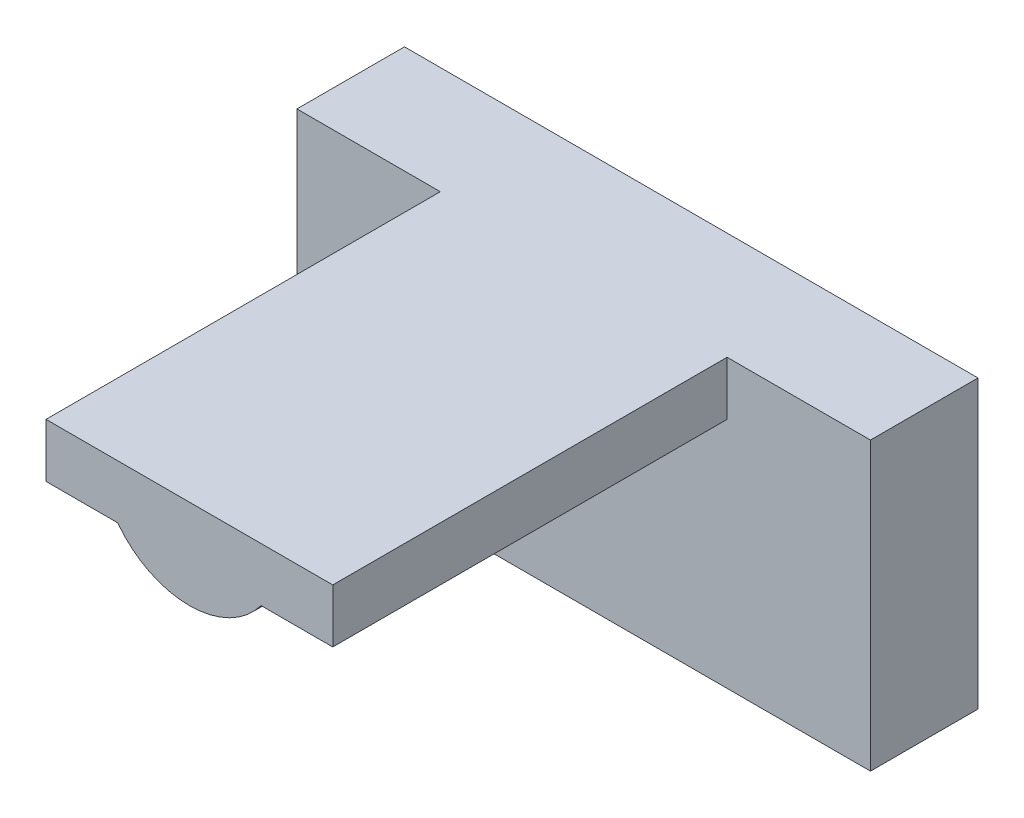
ISO-10303-21;
HEADER;
FILE_DESCRIPTION(('STEP AP214'),'2;1');
FILE_NAME('part.step','',(''),(''),'','','');
FILE_SCHEMA(('AUTOMOTIVE_DESIGN { 1 0 10303 214 1 1 1 1 }'));
ENDSEC;
DATA;
#1=APPLICATION_CONTEXT('core data for automotive mechanical design processes');
#2=APPLICATION_PROTOCOL_DEFINITION('international standard','automotive_design',2000,#1);
#3=PRODUCT_CONTEXT('',#1,'mechanical');
#4=PRODUCT('Part','Part','',(#3));
#5=PRODUCT_RELATED_PRODUCT_CATEGORY('part','',(#4));
#6=PRODUCT_DEFINITION_FORMATION('','',#4);
#7=PRODUCT_DEFINITION_CONTEXT('part definition',#1,'design');
#8=PRODUCT_DEFINITION('design','',#6,#7);
#9=PRODUCT_DEFINITION_SHAPE('','',#8);
#10=(LENGTH_UNIT() NAMED_UNIT(*) SI_UNIT(.MILLI.,.METRE.));
#11=(NAMED_UNIT(*) PLANE_ANGLE_UNIT() SI_UNIT($,.RADIAN.));
#12=(NAMED_UNIT(*) SI_UNIT($,.STERADIAN.) SOLID_ANGLE_UNIT());
#13=UNCERTAINTY_MEASURE_WITH_UNIT(LENGTH_MEASURE(1.E-05),#10,'distance_accuracy_value','');
#14=(GEOMETRIC_REPRESENTATION_CONTEXT(3) GLOBAL_UNCERTAINTY_ASSIGNED_CONTEXT((#13)) GLOBAL_UNIT_ASSIGNED_CONTEXT((#10,
#11,#12)) REPRESENTATION_CONTEXT('',''));
#15=CARTESIAN_POINT('',(0.,0.,0.));
#16=DIRECTION('',(0.,0.,1.));
#17=DIRECTION('',(1.,0.,0.));
#18=AXIS2_PLACEMENT_3D('',#15,#16,#17);
#19=CARTESIAN_POINT('',(0.,0.,3.));
#20=DIRECTION('',(0.,0.,-1.));
#21=DIRECTION('',(-1.,0.,0.));
#22=AXIS2_PLACEMENT_3D('',#19,#20,#21);
#23=PLANE('',#22);
#24=DIRECTION('',(0.,-1.,0.));
#25=VECTOR('',#24,1.);
#26=CARTESIAN_POINT('',(-17.5695150583409,0.,3.));
#27=LINE('',#26,#25);
#28=CARTESIAN_POINT('',(-17.5695150583409,22.0447702701312,3.));
#29=VERTEX_POINT('',#28);
#30=CARTESIAN_POINT('',(-17.5695150583409,20.5447702701312,3.));
#31=VERTEX_POINT('',#30);
#32=EDGE_CURVE('E177',#29,#31,#27,.T.);
#33=ORIENTED_EDGE('',*,*,#32,.F.);
#34=DIRECTION('',(-1.,0.,0.));
#35=VECTOR('',#34,1.);
#36=CARTESIAN_POINT('',(-21.5695150583409,22.0447702701312,3.));
#37=LINE('',#36,#35);
#38=CARTESIAN_POINT('',(-21.5695150583409,22.0447702701312,3.));
#39=VERTEX_POINT('',#38);
#40=EDGE_CURVE('E229',#29,#39,#37,.T.);
#41=ORIENTED_EDGE('',*,*,#40,.T.);
#42=DIRECTION('',(0.,-1.,0.));
#43=VECTOR('',#42,1.);
#44=CARTESIAN_POINT('',(-21.5695150583409,14.0447702701312,3.));
#45=LINE('',#44,#43);
#46=CARTESIAN_POINT('',(-21.5695150583409,14.0447702701312,3.));
#47=VERTEX_POINT('',#46);
#48=EDGE_CURVE('E234',#39,#47,#45,.T.);
#49=ORIENTED_EDGE('',*,*,#48,.T.);
#50=DIRECTION('',(1.,0.,0.));
#51=VECTOR('',#50,1.);
#52=CARTESIAN_POINT('',(-21.5695150583409,14.0447702701312,3.));
#53=LINE('',#52,#51);
#54=CARTESIAN_POINT('',(-5.5695150583409,14.0447702701312,3.));
#55=VERTEX_POINT('',#54);
#56=EDGE_CURVE('E236',#47,#55,#53,.T.);
#57=ORIENTED_EDGE('',*,*,#56,.T.);
#58=DIRECTION('',(0.,1.,0.));
#59=VECTOR('',#58,1.);
#60=CARTESIAN_POINT('',(-5.5695150583409,14.0447702701312,3.));
#61=LINE('',#60,#59);
#62=CARTESIAN_POINT('',(-5.5695150583409,22.0447702701312,3.));
#63=VERTEX_POINT('',#62);
#64=EDGE_CURVE('E226',#55,#63,#61,.T.);
#65=ORIENTED_EDGE('',*,*,#64,.T.);
#66=CARTESIAN_POINT('',(-9.5695150583409,22.0447702701312,3.));
#67=VERTEX_POINT('',#66);
#68=EDGE_CURVE('E231',#63,#67,#37,.T.);
#69=ORIENTED_EDGE('',*,*,#68,.T.);
#70=DIRECTION('',(0.,-1.,0.));
#71=VECTOR('',#70,1.);
#72=CARTESIAN_POINT('',(-9.5695150583409,0.,3.));
#73=LINE('',#72,#71);
#74=CARTESIAN_POINT('',(-9.5695150583409,20.5447702701312,3.));
#75=VERTEX_POINT('',#74);
#76=EDGE_CURVE('E174',#67,#75,#73,.T.);
#77=ORIENTED_EDGE('',*,*,#76,.T.);
#78=DIRECTION('',(-1.,0.,0.));
#79=VECTOR('',#78,1.);
#80=CARTESIAN_POINT('',(0.,20.5447702701312,3.));
#81=LINE('',#80,#79);
#82=CARTESIAN_POINT('',(-11.5695150583409,20.5447702701312,3.));
#83=VERTEX_POINT('',#82);
#84=EDGE_CURVE('E172',#75,#83,#81,.T.);
#85=ORIENTED_EDGE('',*,*,#84,.T.);
#86=CARTESIAN_POINT('',(-13.5695150583409,22.0447702701312,3.));
#87=DIRECTION('',(0.,0.,1.));
#88=DIRECTION('',(1.,0.,0.));
#89=AXIS2_PLACEMENT_3D('',#86,#87,#88);
#90=CIRCLE('',#89,2.5);
#91=CARTESIAN_POINT('',(-15.5695150583409,20.5447702701312,3.));
#92=VERTEX_POINT('',#91);
#93=EDGE_CURVE('E52',#92,#83,#90,.T.);
#94=ORIENTED_EDGE('',*,*,#93,.F.);
#95=DIRECTION('',(1.,0.,0.));
#96=VECTOR('',#95,1.);
#97=CARTESIAN_POINT('',(0.,20.5447702701312,3.));
#98=LINE('',#97,#96);
#99=EDGE_CURVE('E150',#31,#92,#98,.T.);
#100=ORIENTED_EDGE('',*,*,#99,.F.);
#101=EDGE_LOOP('',(#33,#41,#49,#57,#65,#69,#77,#85,#94,#100));
#102=FACE_BOUND('',#101,.T.);
#103=ADVANCED_FACE('F37',(#102),#23,.F.);
#104=CARTESIAN_POINT('',(0.,0.,0.));
#105=DIRECTION('',(0.,0.,-1.));
#106=DIRECTION('',(-1.,0.,0.));
#107=AXIS2_PLACEMENT_3D('',#104,#105,#106);
#108=PLANE('',#107);
#109=DIRECTION('',(0.,1.,0.));
#110=VECTOR('',#109,1.);
#111=CARTESIAN_POINT('',(-5.5695150583409,14.0447702701312,0.));
#112=LINE('',#111,#110);
#113=CARTESIAN_POINT('',(-5.5695150583409,14.0447702701312,0.));
#114=VERTEX_POINT('',#113);
#115=CARTESIAN_POINT('',(-5.5695150583409,22.0447702701312,0.));
#116=VERTEX_POINT('',#115);
#117=EDGE_CURVE('E201',#114,#116,#112,.T.);
#118=ORIENTED_EDGE('',*,*,#117,.F.);
#119=DIRECTION('',(1.,0.,0.));
#120=VECTOR('',#119,1.);
#121=CARTESIAN_POINT('',(-21.5695150583409,14.0447702701312,0.));
#122=LINE('',#121,#120);
#123=CARTESIAN_POINT('',(-21.5695150583409,14.0447702701312,0.));
#124=VERTEX_POINT('',#123);
#125=EDGE_CURVE('E230',#124,#114,#122,.T.);
#126=ORIENTED_EDGE('',*,*,#125,.F.);
#127=DIRECTION('',(0.,-1.,0.));
#128=VECTOR('',#127,1.);
#129=CARTESIAN_POINT('',(-21.5695150583409,14.0447702701312,0.));
#130=LINE('',#129,#128);
#131=CARTESIAN_POINT('',(-21.5695150583409,22.0447702701312,0.));
#132=VERTEX_POINT('',#131);
#133=EDGE_CURVE('E243',#132,#124,#130,.T.);
#134=ORIENTED_EDGE('',*,*,#133,.F.);
#135=DIRECTION('',(-1.,0.,0.));
#136=VECTOR('',#135,1.);
#137=CARTESIAN_POINT('',(-21.5695150583409,22.0447702701312,0.));
#138=LINE('',#137,#136);
#139=EDGE_CURVE('E241',#116,#132,#138,.T.);
#140=ORIENTED_EDGE('',*,*,#139,.F.);
#141=EDGE_LOOP('',(#118,#126,#134,#140));
#142=FACE_BOUND('',#141,.T.);
#143=DIRECTION('',(1.,0.,0.));
#144=VECTOR('',#143,1.);
#145=CARTESIAN_POINT('',(0.,15.0447702701312,0.));
#146=LINE('',#145,#144);
#147=CARTESIAN_POINT('',(-20.5695150583409,15.0447702701312,0.));
#148=VERTEX_POINT('',#147);
#149=CARTESIAN_POINT('',(-6.5695150583409,15.0447702701312,0.));
#150=VERTEX_POINT('',#149);
#151=EDGE_CURVE('E207',#148,#150,#146,.T.);
#152=ORIENTED_EDGE('',*,*,#151,.T.);
#153=DIRECTION('',(0.,1.,0.));
#154=VECTOR('',#153,1.);
#155=CARTESIAN_POINT('',(-6.5695150583409,0.,0.));
#156=LINE('',#155,#154);
#157=CARTESIAN_POINT('',(-6.5695150583409,21.0447702701312,0.));
#158=VERTEX_POINT('',#157);
#159=EDGE_CURVE('E195',#150,#158,#156,.T.);
#160=ORIENTED_EDGE('',*,*,#159,.T.);
#161=DIRECTION('',(-1.,0.,0.));
#162=VECTOR('',#161,1.);
#163=CARTESIAN_POINT('',(0.,21.0447702701312,0.));
#164=LINE('',#163,#162);
#165=CARTESIAN_POINT('',(-20.5695150583409,21.0447702701312,0.));
#166=VERTEX_POINT('',#165);
#167=EDGE_CURVE('E220',#158,#166,#164,.T.);
#168=ORIENTED_EDGE('',*,*,#167,.T.);
#169=DIRECTION('',(0.,-1.,0.));
#170=VECTOR('',#169,1.);
#171=CARTESIAN_POINT('',(-20.5695150583409,0.,0.));
#172=LINE('',#171,#170);
#173=EDGE_CURVE('E60',#166,#148,#172,.T.);
#174=ORIENTED_EDGE('',*,*,#173,.T.);
#175=EDGE_LOOP('',(#152,#160,#168,#174));
#176=FACE_BOUND('',#175,.T.);
#177=ADVANCED_FACE('F264',(#142,#176),#108,.T.);
#178=CARTESIAN_POINT('',(-5.5695150583409,14.0447702701312,3.));
#179=DIRECTION('',(-1.,0.,0.));
#180=DIRECTION('',(0.,0.,1.));
#181=AXIS2_PLACEMENT_3D('',#178,#179,#180);
#182=PLANE('',#181);
#183=ORIENTED_EDGE('',*,*,#117,.T.);
#184=DIRECTION('',(0.,0.,-1.));
#185=VECTOR('',#184,1.);
#186=CARTESIAN_POINT('',(-5.5695150583409,22.0447702701312,3.));
#187=LINE('',#186,#185);
#188=EDGE_CURVE('E45',#63,#116,#187,.T.);
#189=ORIENTED_EDGE('',*,*,#188,.F.);
#190=ORIENTED_EDGE('',*,*,#64,.F.);
#191=DIRECTION('',(0.,0.,-1.));
#192=VECTOR('',#191,1.);
#193=CARTESIAN_POINT('',(-5.5695150583409,14.0447702701312,3.));
#194=LINE('',#193,#192);
#195=EDGE_CURVE('E238',#55,#114,#194,.T.);
#196=ORIENTED_EDGE('',*,*,#195,.T.);
#197=EDGE_LOOP('',(#183,#189,#190,#196));
#198=FACE_BOUND('',#197,.T.);
#199=ADVANCED_FACE('F39',(#198),#182,.F.);
#200=CARTESIAN_POINT('',(-21.5695150583409,22.0447702701312,3.));
#201=DIRECTION('',(0.,-1.,0.));
#202=DIRECTION('',(0.,0.,-1.));
#203=AXIS2_PLACEMENT_3D('',#200,#201,#202);
#204=PLANE('',#203);
#205=ORIENTED_EDGE('',*,*,#139,.T.);
#206=DIRECTION('',(0.,0.,-1.));
#207=VECTOR('',#206,1.);
#208=CARTESIAN_POINT('',(-21.5695150583409,22.0447702701312,3.));
#209=LINE('',#208,#207);
#210=EDGE_CURVE('E251',#39,#132,#209,.T.);
#211=ORIENTED_EDGE('',*,*,#210,.F.);
#212=ORIENTED_EDGE('',*,*,#40,.F.);
#213=DIRECTION('',(0.,0.,-1.));
#214=VECTOR('',#213,1.);
#215=CARTESIAN_POINT('',(-17.5695150583409,22.0447702701312,14.));
#216=LINE('',#215,#214);
#217=CARTESIAN_POINT('',(-17.5695150583409,22.0447702701312,14.));
#218=VERTEX_POINT('',#217);
#219=EDGE_CURVE('E184',#218,#29,#216,.T.);
#220=ORIENTED_EDGE('',*,*,#219,.F.);
#221=DIRECTION('',(-1.,0.,0.));
#222=VECTOR('',#221,1.);
#223=CARTESIAN_POINT('',(0.,22.0447702701312,14.));
#224=LINE('',#223,#222);
#225=CARTESIAN_POINT('',(-9.5695150583409,22.0447702701312,14.));
#226=VERTEX_POINT('',#225);
#227=EDGE_CURVE('E163',#226,#218,#224,.T.);
#228=ORIENTED_EDGE('',*,*,#227,.F.);
#229=DIRECTION('',(0.,0.,-1.));
#230=VECTOR('',#229,1.);
#231=CARTESIAN_POINT('',(-9.5695150583409,22.0447702701312,14.));
#232=LINE('',#231,#230);
#233=EDGE_CURVE('E186',#226,#67,#232,.T.);
#234=ORIENTED_EDGE('',*,*,#233,.T.);
#235=ORIENTED_EDGE('',*,*,#68,.F.);
#236=ORIENTED_EDGE('',*,*,#188,.T.);
#237=EDGE_LOOP('',(#205,#211,#212,#220,#228,#234,#235,#236));
#238=FACE_BOUND('',#237,.T.);
#239=ADVANCED_FACE('F256',(#238),#204,.F.);
#240=CARTESIAN_POINT('',(-21.5695150583409,14.0447702701312,3.));
#241=DIRECTION('',(1.,0.,0.));
#242=DIRECTION('',(0.,0.,-1.));
#243=AXIS2_PLACEMENT_3D('',#240,#241,#242);
#244=PLANE('',#243);
#245=ORIENTED_EDGE('',*,*,#133,.T.);
#246=DIRECTION('',(0.,0.,-1.));
#247=VECTOR('',#246,1.);
#248=CARTESIAN_POINT('',(-21.5695150583409,14.0447702701312,3.));
#249=LINE('',#248,#247);
#250=EDGE_CURVE('E248',#47,#124,#249,.T.);
#251=ORIENTED_EDGE('',*,*,#250,.F.);
#252=ORIENTED_EDGE('',*,*,#48,.F.);
#253=ORIENTED_EDGE('',*,*,#210,.T.);
#254=EDGE_LOOP('',(#245,#251,#252,#253));
#255=FACE_BOUND('',#254,.T.);
#256=ADVANCED_FACE('F269',(#255),#244,.F.);
#257=CARTESIAN_POINT('',(-21.5695150583409,14.0447702701312,3.));
#258=DIRECTION('',(0.,1.,0.));
#259=DIRECTION('',(0.,0.,1.));
#260=AXIS2_PLACEMENT_3D('',#257,#258,#259);
#261=PLANE('',#260);
#262=ORIENTED_EDGE('',*,*,#125,.T.);
#263=ORIENTED_EDGE('',*,*,#195,.F.);
#264=ORIENTED_EDGE('',*,*,#56,.F.);
#265=ORIENTED_EDGE('',*,*,#250,.T.);
#266=EDGE_LOOP('',(#262,#263,#264,#265));
#267=FACE_BOUND('',#266,.T.);
#268=ADVANCED_FACE('F273',(#267),#261,.F.);
#269=CARTESIAN_POINT('',(-6.5695150583409,14.0447702701312,3.));
#270=DIRECTION('',(-1.,0.,0.));
#271=DIRECTION('',(0.,0.,1.));
#272=AXIS2_PLACEMENT_3D('',#269,#270,#271);
#273=PLANE('',#272);
#274=ORIENTED_EDGE('',*,*,#159,.F.);
#275=DIRECTION('',(0.,0.,-1.));
#276=VECTOR('',#275,1.);
#277=CARTESIAN_POINT('',(-6.5695150583409,15.0447702701312,3.));
#278=LINE('',#277,#276);
#279=CARTESIAN_POINT('',(-6.5695150583409,15.0447702701312,2.));
#280=VERTEX_POINT('',#279);
#281=EDGE_CURVE('E208',#280,#150,#278,.T.);
#282=ORIENTED_EDGE('',*,*,#281,.F.);
#283=DIRECTION('',(0.,1.,0.));
#284=VECTOR('',#283,1.);
#285=CARTESIAN_POINT('',(-6.5695150583409,0.,2.));
#286=LINE('',#285,#284);
#287=CARTESIAN_POINT('',(-6.5695150583409,21.0447702701312,2.));
#288=VERTEX_POINT('',#287);
#289=EDGE_CURVE('E203',#280,#288,#286,.T.);
#290=ORIENTED_EDGE('',*,*,#289,.T.);
#291=DIRECTION('',(0.,0.,-1.));
#292=VECTOR('',#291,1.);
#293=CARTESIAN_POINT('',(-6.5695150583409,21.0447702701312,3.));
#294=LINE('',#293,#292);
#295=EDGE_CURVE('E198',#288,#158,#294,.T.);
#296=ORIENTED_EDGE('',*,*,#295,.T.);
#297=EDGE_LOOP('',(#274,#282,#290,#296));
#298=FACE_BOUND('',#297,.T.);
#299=ADVANCED_FACE('F309',(#298),#273,.T.);
#300=CARTESIAN_POINT('',(-21.5695150583409,21.0447702701312,3.));
#301=DIRECTION('',(0.,-1.,0.));
#302=DIRECTION('',(0.,0.,-1.));
#303=AXIS2_PLACEMENT_3D('',#300,#301,#302);
#304=PLANE('',#303);
#305=ORIENTED_EDGE('',*,*,#167,.F.);
#306=ORIENTED_EDGE('',*,*,#295,.F.);
#307=DIRECTION('',(-1.,0.,0.));
#308=VECTOR('',#307,1.);
#309=CARTESIAN_POINT('',(0.,21.0447702701312,2.));
#310=LINE('',#309,#308);
#311=CARTESIAN_POINT('',(-20.5695150583409,21.0447702701312,2.));
#312=VERTEX_POINT('',#311);
#313=EDGE_CURVE('E206',#288,#312,#310,.T.);
#314=ORIENTED_EDGE('',*,*,#313,.T.);
#315=DIRECTION('',(0.,0.,-1.));
#316=VECTOR('',#315,1.);
#317=CARTESIAN_POINT('',(-20.5695150583409,21.0447702701312,3.));
#318=LINE('',#317,#316);
#319=EDGE_CURVE('E202',#312,#166,#318,.T.);
#320=ORIENTED_EDGE('',*,*,#319,.T.);
#321=EDGE_LOOP('',(#305,#306,#314,#320));
#322=FACE_BOUND('',#321,.T.);
#323=ADVANCED_FACE('F334',(#322),#304,.T.);
#324=CARTESIAN_POINT('',(-20.5695150583409,14.0447702701312,3.));
#325=DIRECTION('',(1.,0.,0.));
#326=DIRECTION('',(0.,0.,-1.));
#327=AXIS2_PLACEMENT_3D('',#324,#325,#326);
#328=PLANE('',#327);
#329=ORIENTED_EDGE('',*,*,#173,.F.);
#330=ORIENTED_EDGE('',*,*,#319,.F.);
#331=DIRECTION('',(0.,-1.,0.));
#332=VECTOR('',#331,1.);
#333=CARTESIAN_POINT('',(-20.5695150583409,0.,2.));
#334=LINE('',#333,#332);
#335=CARTESIAN_POINT('',(-20.5695150583409,15.0447702701312,2.));
#336=VERTEX_POINT('',#335);
#337=EDGE_CURVE('E214',#312,#336,#334,.T.);
#338=ORIENTED_EDGE('',*,*,#337,.T.);
#339=DIRECTION('',(0.,0.,-1.));
#340=VECTOR('',#339,1.);
#341=CARTESIAN_POINT('',(-20.5695150583409,15.0447702701312,3.));
#342=LINE('',#341,#340);
#343=EDGE_CURVE('E210',#336,#148,#342,.T.);
#344=ORIENTED_EDGE('',*,*,#343,.T.);
#345=EDGE_LOOP('',(#329,#330,#338,#344));
#346=FACE_BOUND('',#345,.T.);
#347=ADVANCED_FACE('F344',(#346),#328,.T.);
#348=CARTESIAN_POINT('',(-21.5695150583409,15.0447702701312,3.));
#349=DIRECTION('',(0.,1.,0.));
#350=DIRECTION('',(0.,0.,1.));
#351=AXIS2_PLACEMENT_3D('',#348,#349,#350);
#352=PLANE('',#351);
#353=ORIENTED_EDGE('',*,*,#151,.F.);
#354=ORIENTED_EDGE('',*,*,#343,.F.);
#355=DIRECTION('',(1.,0.,0.));
#356=VECTOR('',#355,1.);
#357=CARTESIAN_POINT('',(0.,15.0447702701312,2.));
#358=LINE('',#357,#356);
#359=EDGE_CURVE('E211',#336,#280,#358,.T.);
#360=ORIENTED_EDGE('',*,*,#359,.T.);
#361=ORIENTED_EDGE('',*,*,#281,.T.);
#362=EDGE_LOOP('',(#353,#354,#360,#361));
#363=FACE_BOUND('',#362,.T.);
#364=ADVANCED_FACE('F354',(#363),#352,.T.);
#365=CARTESIAN_POINT('',(0.,0.,2.));
#366=DIRECTION('',(0.,0.,-1.));
#367=DIRECTION('',(-1.,0.,0.));
#368=AXIS2_PLACEMENT_3D('',#365,#366,#367);
#369=PLANE('',#368);
#370=CARTESIAN_POINT('',(-13.5695150583409,18.0447702701312,2.));
#371=DIRECTION('',(0.,0.,-1.));
#372=DIRECTION('',(-1.,0.,0.));
#373=AXIS2_PLACEMENT_3D('',#370,#371,#372);
#374=CIRCLE('',#373,1.5);
#375=CARTESIAN_POINT('',(-15.0695150583409,18.0447702701312,2.));
#376=VERTEX_POINT('',#375);
#377=EDGE_CURVE('E191',#376,#376,#374,.T.);
#378=ORIENTED_EDGE('',*,*,#377,.F.);
#379=EDGE_LOOP('',(#378));
#380=FACE_BOUND('',#379,.T.);
#381=ORIENTED_EDGE('',*,*,#289,.F.);
#382=ORIENTED_EDGE('',*,*,#359,.F.);
#383=ORIENTED_EDGE('',*,*,#337,.F.);
#384=ORIENTED_EDGE('',*,*,#313,.F.);
#385=EDGE_LOOP('',(#381,#382,#383,#384));
#386=FACE_BOUND('',#385,.T.);
#387=ADVANCED_FACE('F304',(#380,#386),#369,.T.);
#388=CARTESIAN_POINT('',(-13.5695150583409,18.0447702701312,0.));
#389=DIRECTION('',(0.,0.,-1.));
#390=DIRECTION('',(-1.,0.,0.));
#391=AXIS2_PLACEMENT_3D('',#388,#389,#390);
#392=PLANE('',#391);
#393=CARTESIAN_POINT('',(-13.5695150583409,18.0447702701312,0.));
#394=DIRECTION('',(0.,0.,-1.));
#395=DIRECTION('',(-1.,0.,0.));
#396=AXIS2_PLACEMENT_3D('',#393,#394,#395);
#397=CIRCLE('',#396,1.5);
#398=CARTESIAN_POINT('',(-15.0695150583409,18.0447702701312,0.));
#399=VERTEX_POINT('',#398);
#400=EDGE_CURVE('E192',#399,#399,#397,.T.);
#401=ORIENTED_EDGE('',*,*,#400,.T.);
#402=EDGE_LOOP('',(#401));
#403=FACE_BOUND('',#402,.T.);
#404=CARTESIAN_POINT('',(-13.5695150583409,18.0447702701312,0.));
#405=DIRECTION('',(0.,0.,-1.));
#406=DIRECTION('',(-1.,0.,0.));
#407=AXIS2_PLACEMENT_3D('',#404,#405,#406);
#408=CIRCLE('',#407,0.8);
#409=CARTESIAN_POINT('',(-14.3695150583409,18.0447702701312,0.));
#410=VERTEX_POINT('',#409);
#411=EDGE_CURVE('E157',#410,#410,#408,.T.);
#412=ORIENTED_EDGE('',*,*,#411,.F.);
#413=EDGE_LOOP('',(#412));
#414=FACE_BOUND('',#413,.T.);
#415=ADVANCED_FACE('F371',(#403,#414),#392,.T.);
#416=CARTESIAN_POINT('',(-13.5695150583409,18.0447702701312,0.));
#417=DIRECTION('',(0.,0.,1.));
#418=DIRECTION('',(1.,0.,0.));
#419=AXIS2_PLACEMENT_3D('',#416,#417,#418);
#420=CYLINDRICAL_SURFACE('',#419,1.5);
#421=ORIENTED_EDGE('',*,*,#400,.F.);
#422=EDGE_LOOP('',(#421));
#423=FACE_BOUND('',#422,.T.);
#424=ORIENTED_EDGE('',*,*,#377,.T.);
#425=EDGE_LOOP('',(#424));
#426=FACE_BOUND('',#425,.T.);
#427=ADVANCED_FACE('F382',(#423,#426),#420,.T.);
#428=CARTESIAN_POINT('',(-13.5695150583409,18.0447702701312,0.));
#429=DIRECTION('',(0.,0.,1.));
#430=DIRECTION('',(1.,0.,0.));
#431=AXIS2_PLACEMENT_3D('',#428,#429,#430);
#432=CYLINDRICAL_SURFACE('',#431,0.8);
#433=ORIENTED_EDGE('',*,*,#411,.T.);
#434=EDGE_LOOP('',(#433));
#435=FACE_BOUND('',#434,.T.);
#436=CARTESIAN_POINT('',(-13.5695150583409,18.0447702701312,2.));
#437=DIRECTION('',(0.,0.,-1.));
#438=DIRECTION('',(-1.,0.,0.));
#439=AXIS2_PLACEMENT_3D('',#436,#437,#438);
#440=CIRCLE('',#439,0.8);
#441=CARTESIAN_POINT('',(-14.3695150583409,18.0447702701312,2.));
#442=VERTEX_POINT('',#441);
#443=EDGE_CURVE('E11',#442,#442,#440,.F.);
#444=ORIENTED_EDGE('',*,*,#443,.T.);
#445=EDGE_LOOP('',(#444));
#446=FACE_BOUND('',#445,.T.);
#447=ADVANCED_FACE('F392',(#435,#446),#432,.F.);
#448=ORIENTED_EDGE('',*,*,#443,.F.);
#449=EDGE_LOOP('',(#448));
#450=FACE_BOUND('',#449,.T.);
#451=ADVANCED_FACE('F373',(#450),#369,.T.);
#452=CARTESIAN_POINT('',(-13.5695150583409,22.0447702701312,14.));
#453=DIRECTION('',(0.,0.,-1.));
#454=DIRECTION('',(-1.,0.,0.));
#455=AXIS2_PLACEMENT_3D('',#452,#453,#454);
#456=CYLINDRICAL_SURFACE('',#455,2.5);
#457=ORIENTED_EDGE('',*,*,#93,.T.);
#458=DIRECTION('',(0.,0.,-1.));
#459=VECTOR('',#458,1.);
#460=CARTESIAN_POINT('',(-11.5695150583409,20.5447702701312,14.));
#461=LINE('',#460,#459);
#462=CARTESIAN_POINT('',(-11.5695150583409,20.5447702701312,14.));
#463=VERTEX_POINT('',#462);
#464=EDGE_CURVE('E152',#463,#83,#461,.T.);
#465=ORIENTED_EDGE('',*,*,#464,.F.);
#466=CARTESIAN_POINT('',(-13.5695150583409,22.0447702701312,14.));
#467=DIRECTION('',(0.,0.,1.));
#468=DIRECTION('',(1.,0.,0.));
#469=AXIS2_PLACEMENT_3D('',#466,#467,#468);
#470=CIRCLE('',#469,2.5);
#471=CARTESIAN_POINT('',(-15.5695150583409,20.5447702701312,14.));
#472=VERTEX_POINT('',#471);
#473=EDGE_CURVE('E141',#472,#463,#470,.T.);
#474=ORIENTED_EDGE('',*,*,#473,.F.);
#475=DIRECTION('',(0.,0.,-1.));
#476=VECTOR('',#475,1.);
#477=CARTESIAN_POINT('',(-15.5695150583409,20.5447702701312,14.));
#478=LINE('',#477,#476);
#479=EDGE_CURVE('E170',#472,#92,#478,.T.);
#480=ORIENTED_EDGE('',*,*,#479,.T.);
#481=EDGE_LOOP('',(#457,#465,#474,#480));
#482=FACE_BOUND('',#481,.T.);
#483=ADVANCED_FACE('F153',(#482),#456,.T.);
#484=CARTESIAN_POINT('',(0.,20.5447702701312,14.));
#485=DIRECTION('',(0.,-1.,0.));
#486=DIRECTION('',(0.,0.,-1.));
#487=AXIS2_PLACEMENT_3D('',#484,#485,#486);
#488=PLANE('',#487);
#489=ORIENTED_EDGE('',*,*,#84,.F.);
#490=DIRECTION('',(0.,0.,-1.));
#491=VECTOR('',#490,1.);
#492=CARTESIAN_POINT('',(-9.5695150583409,20.5447702701312,14.));
#493=LINE('',#492,#491);
#494=CARTESIAN_POINT('',(-9.5695150583409,20.5447702701312,14.));
#495=VERTEX_POINT('',#494);
#496=EDGE_CURVE('E158',#495,#75,#493,.T.);
#497=ORIENTED_EDGE('',*,*,#496,.F.);
#498=DIRECTION('',(-1.,0.,0.));
#499=VECTOR('',#498,1.);
#500=CARTESIAN_POINT('',(0.,20.5447702701312,14.));
#501=LINE('',#500,#499);
#502=EDGE_CURVE('E145',#495,#463,#501,.T.);
#503=ORIENTED_EDGE('',*,*,#502,.T.);
#504=ORIENTED_EDGE('',*,*,#464,.T.);
#505=EDGE_LOOP('',(#489,#497,#503,#504));
#506=FACE_BOUND('',#505,.T.);
#507=ADVANCED_FACE('F160',(#506),#488,.T.);
#508=CARTESIAN_POINT('',(-9.5695150583409,0.,14.));
#509=DIRECTION('',(1.,0.,0.));
#510=DIRECTION('',(0.,0.,-1.));
#511=AXIS2_PLACEMENT_3D('',#508,#509,#510);
#512=PLANE('',#511);
#513=ORIENTED_EDGE('',*,*,#76,.F.);
#514=ORIENTED_EDGE('',*,*,#233,.F.);
#515=DIRECTION('',(0.,-1.,0.));
#516=VECTOR('',#515,1.);
#517=CARTESIAN_POINT('',(-9.5695150583409,0.,14.));
#518=LINE('',#517,#516);
#519=EDGE_CURVE('E161',#226,#495,#518,.T.);
#520=ORIENTED_EDGE('',*,*,#519,.T.);
#521=ORIENTED_EDGE('',*,*,#496,.T.);
#522=EDGE_LOOP('',(#513,#514,#520,#521));
#523=FACE_BOUND('',#522,.T.);
#524=ADVANCED_FACE('F286',(#523),#512,.T.);
#525=CARTESIAN_POINT('',(-17.5695150583409,0.,14.));
#526=DIRECTION('',(1.,0.,0.));
#527=DIRECTION('',(0.,0.,-1.));
#528=AXIS2_PLACEMENT_3D('',#525,#526,#527);
#529=PLANE('',#528);
#530=ORIENTED_EDGE('',*,*,#32,.T.);
#531=DIRECTION('',(0.,0.,-1.));
#532=VECTOR('',#531,1.);
#533=CARTESIAN_POINT('',(-17.5695150583409,20.5447702701312,14.));
#534=LINE('',#533,#532);
#535=CARTESIAN_POINT('',(-17.5695150583409,20.5447702701312,14.));
#536=VERTEX_POINT('',#535);
#537=EDGE_CURVE('E181',#536,#31,#534,.T.);
#538=ORIENTED_EDGE('',*,*,#537,.F.);
#539=DIRECTION('',(0.,-1.,0.));
#540=VECTOR('',#539,1.);
#541=CARTESIAN_POINT('',(-17.5695150583409,0.,14.));
#542=LINE('',#541,#540);
#543=EDGE_CURVE('E167',#218,#536,#542,.T.);
#544=ORIENTED_EDGE('',*,*,#543,.F.);
#545=ORIENTED_EDGE('',*,*,#219,.T.);
#546=EDGE_LOOP('',(#530,#538,#544,#545));
#547=FACE_BOUND('',#546,.T.);
#548=ADVANCED_FACE('F283',(#547),#529,.F.);
#549=CARTESIAN_POINT('',(0.,20.5447702701312,14.));
#550=DIRECTION('',(0.,1.,0.));
#551=DIRECTION('',(0.,0.,1.));
#552=AXIS2_PLACEMENT_3D('',#549,#550,#551);
#553=PLANE('',#552);
#554=ORIENTED_EDGE('',*,*,#99,.T.);
#555=ORIENTED_EDGE('',*,*,#479,.F.);
#556=DIRECTION('',(1.,0.,0.));
#557=VECTOR('',#556,1.);
#558=CARTESIAN_POINT('',(0.,20.5447702701312,14.));
#559=LINE('',#558,#557);
#560=EDGE_CURVE('E148',#536,#472,#559,.T.);
#561=ORIENTED_EDGE('',*,*,#560,.F.);
#562=ORIENTED_EDGE('',*,*,#537,.T.);
#563=EDGE_LOOP('',(#554,#555,#561,#562));
#564=FACE_BOUND('',#563,.T.);
#565=ADVANCED_FACE('F288',(#564),#553,.F.);
#566=CARTESIAN_POINT('',(0.,0.,14.));
#567=DIRECTION('',(0.,0.,1.));
#568=DIRECTION('',(1.,0.,0.));
#569=AXIS2_PLACEMENT_3D('',#566,#567,#568);
#570=PLANE('',#569);
#571=ORIENTED_EDGE('',*,*,#473,.T.);
#572=ORIENTED_EDGE('',*,*,#502,.F.);
#573=ORIENTED_EDGE('',*,*,#519,.F.);
#574=ORIENTED_EDGE('',*,*,#227,.T.);
#575=ORIENTED_EDGE('',*,*,#543,.T.);
#576=ORIENTED_EDGE('',*,*,#560,.T.);
#577=EDGE_LOOP('',(#571,#572,#573,#574,#575,#576));
#578=FACE_BOUND('',#577,.T.);
#579=ADVANCED_FACE('F142',(#578),#570,.T.);
#580=CLOSED_SHELL('',(#103,#177,#199,#239,#256,#268,#299,#323,#347,#364,#387,#415,#427,#447,
#451,#483,#507,#524,#548,#565,#579));
#581=MANIFOLD_SOLID_BREP('B2',#580);
#582=ADVANCED_BREP_SHAPE_REPRESENTATION('',(#18,#581),#14);
#583=SHAPE_DEFINITION_REPRESENTATION(#9,#582);
ENDSEC;
END-ISO-10303-21;
